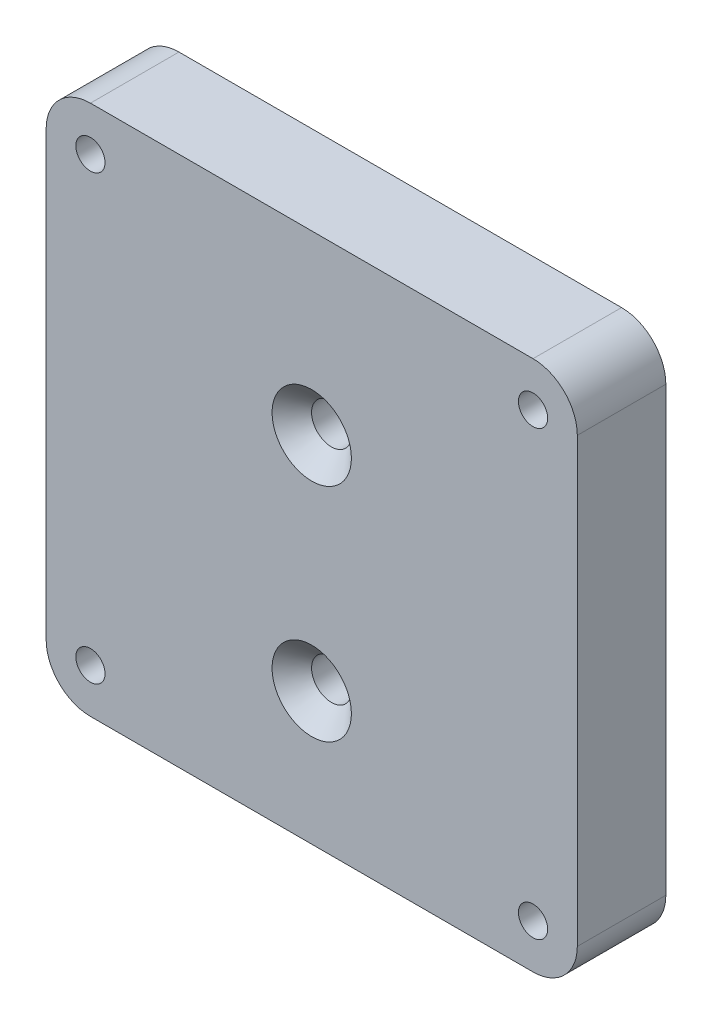
ISO-10303-21;
HEADER;
FILE_DESCRIPTION(('STEP AP214'),'2;1');
FILE_NAME('part.step','',(''),(''),'','','');
FILE_SCHEMA(('AUTOMOTIVE_DESIGN { 1 0 10303 214 1 1 1 1 }'));
ENDSEC;
DATA;
#1=APPLICATION_CONTEXT('core data for automotive mechanical design processes');
#2=APPLICATION_PROTOCOL_DEFINITION('international standard','automotive_design',2000,#1);
#3=PRODUCT_CONTEXT('',#1,'mechanical');
#4=PRODUCT('Part','Part','',(#3));
#5=PRODUCT_RELATED_PRODUCT_CATEGORY('part','',(#4));
#6=PRODUCT_DEFINITION_FORMATION('','',#4);
#7=PRODUCT_DEFINITION_CONTEXT('part definition',#1,'design');
#8=PRODUCT_DEFINITION('design','',#6,#7);
#9=PRODUCT_DEFINITION_SHAPE('','',#8);
#10=(LENGTH_UNIT() NAMED_UNIT(*) SI_UNIT(.MILLI.,.METRE.));
#11=(NAMED_UNIT(*) PLANE_ANGLE_UNIT() SI_UNIT($,.RADIAN.));
#12=(NAMED_UNIT(*) SI_UNIT($,.STERADIAN.) SOLID_ANGLE_UNIT());
#13=UNCERTAINTY_MEASURE_WITH_UNIT(LENGTH_MEASURE(1.E-05),#10,'distance_accuracy_value','');
#14=(GEOMETRIC_REPRESENTATION_CONTEXT(3) GLOBAL_UNCERTAINTY_ASSIGNED_CONTEXT((#13)) GLOBAL_UNIT_ASSIGNED_CONTEXT((#10,
#11,#12)) REPRESENTATION_CONTEXT('',''));
#15=CARTESIAN_POINT('',(0.,0.,0.));
#16=DIRECTION('',(0.,0.,1.));
#17=DIRECTION('',(1.,0.,0.));
#18=AXIS2_PLACEMENT_3D('',#15,#16,#17);
#19=CARTESIAN_POINT('',(0.,60.,10.));
#20=DIRECTION('',(1.,0.,0.));
#21=DIRECTION('',(0.,1.,0.));
#22=AXIS2_PLACEMENT_3D('',#19,#20,#21);
#23=PLANE('',#22);
#24=DIRECTION('',(0.,-1.,0.));
#25=VECTOR('',#24,1.);
#26=CARTESIAN_POINT('',(0.,60.,10.));
#27=LINE('',#26,#25);
#28=CARTESIAN_POINT('',(0.,55.,10.));
#29=VERTEX_POINT('',#28);
#30=CARTESIAN_POINT('',(0.,5.,10.));
#31=VERTEX_POINT('',#30);
#32=EDGE_CURVE('E195',#29,#31,#27,.T.);
#33=ORIENTED_EDGE('',*,*,#32,.F.);
#34=DIRECTION('',(0.,0.,-1.));
#35=VECTOR('',#34,1.);
#36=CARTESIAN_POINT('',(0.,55.,10.));
#37=LINE('',#36,#35);
#38=CARTESIAN_POINT('',(0.,55.,0.));
#39=VERTEX_POINT('',#38);
#40=EDGE_CURVE('E217',#29,#39,#37,.T.);
#41=ORIENTED_EDGE('',*,*,#40,.T.);
#42=DIRECTION('',(0.,-1.,0.));
#43=VECTOR('',#42,1.);
#44=CARTESIAN_POINT('',(0.,60.,0.));
#45=LINE('',#44,#43);
#46=CARTESIAN_POINT('',(0.,5.,0.));
#47=VERTEX_POINT('',#46);
#48=EDGE_CURVE('E194',#39,#47,#45,.T.);
#49=ORIENTED_EDGE('',*,*,#48,.T.);
#50=DIRECTION('',(0.,0.,-1.));
#51=VECTOR('',#50,1.);
#52=CARTESIAN_POINT('',(0.,5.,10.));
#53=LINE('',#52,#51);
#54=EDGE_CURVE('E206',#47,#31,#53,.F.);
#55=ORIENTED_EDGE('',*,*,#54,.T.);
#56=EDGE_LOOP('',(#33,#41,#49,#55));
#57=FACE_BOUND('',#56,.T.);
#58=ADVANCED_FACE('F40',(#57),#23,.F.);
#59=CARTESIAN_POINT('',(0.,0.,10.));
#60=DIRECTION('',(0.,1.,0.));
#61=DIRECTION('',(0.,0.,1.));
#62=AXIS2_PLACEMENT_3D('',#59,#60,#61);
#63=PLANE('',#62);
#64=CARTESIAN_POINT('',(30.,0.,5.));
#65=DIRECTION('',(0.,-1.,0.));
#66=DIRECTION('',(0.,0.,-1.));
#67=AXIS2_PLACEMENT_3D('',#64,#65,#66);
#68=CIRCLE('',#67,1.64999999999999);
#69=CARTESIAN_POINT('',(30.,0.,3.35000000000001));
#70=VERTEX_POINT('',#69);
#71=EDGE_CURVE('E136',#70,#70,#68,.T.);
#72=ORIENTED_EDGE('',*,*,#71,.F.);
#73=EDGE_LOOP('',(#72));
#74=FACE_BOUND('',#73,.T.);
#75=CARTESIAN_POINT('',(14.,0.,5.));
#76=DIRECTION('',(0.,-1.,0.));
#77=DIRECTION('',(0.,0.,-1.));
#78=AXIS2_PLACEMENT_3D('',#75,#76,#77);
#79=CIRCLE('',#78,1.64999999999999);
#80=CARTESIAN_POINT('',(14.,0.,3.35000000000001));
#81=VERTEX_POINT('',#80);
#82=EDGE_CURVE('E135',#81,#81,#79,.T.);
#83=ORIENTED_EDGE('',*,*,#82,.F.);
#84=EDGE_LOOP('',(#83));
#85=FACE_BOUND('',#84,.T.);
#86=CARTESIAN_POINT('',(46.,0.,5.));
#87=DIRECTION('',(0.,-1.,0.));
#88=DIRECTION('',(0.,0.,-1.));
#89=AXIS2_PLACEMENT_3D('',#86,#87,#88);
#90=CIRCLE('',#89,1.64999999999999);
#91=CARTESIAN_POINT('',(46.,0.,3.35000000000001));
#92=VERTEX_POINT('',#91);
#93=EDGE_CURVE('E146',#92,#92,#90,.T.);
#94=ORIENTED_EDGE('',*,*,#93,.F.);
#95=EDGE_LOOP('',(#94));
#96=FACE_BOUND('',#95,.T.);
#97=DIRECTION('',(1.,0.,0.));
#98=VECTOR('',#97,1.);
#99=CARTESIAN_POINT('',(0.,0.,0.));
#100=LINE('',#99,#98);
#101=CARTESIAN_POINT('',(5.,0.,0.));
#102=VERTEX_POINT('',#101);
#103=CARTESIAN_POINT('',(55.,0.,0.));
#104=VERTEX_POINT('',#103);
#105=EDGE_CURVE('E209',#102,#104,#100,.T.);
#106=ORIENTED_EDGE('',*,*,#105,.T.);
#107=DIRECTION('',(0.,0.,-1.));
#108=VECTOR('',#107,1.);
#109=CARTESIAN_POINT('',(55.,0.,10.));
#110=LINE('',#109,#108);
#111=CARTESIAN_POINT('',(55.,0.,10.));
#112=VERTEX_POINT('',#111);
#113=EDGE_CURVE('E11',#104,#112,#110,.F.);
#114=ORIENTED_EDGE('',*,*,#113,.T.);
#115=DIRECTION('',(1.,0.,0.));
#116=VECTOR('',#115,1.);
#117=CARTESIAN_POINT('',(0.,0.,10.));
#118=LINE('',#117,#116);
#119=CARTESIAN_POINT('',(5.,0.,10.));
#120=VERTEX_POINT('',#119);
#121=EDGE_CURVE('E198',#120,#112,#118,.T.);
#122=ORIENTED_EDGE('',*,*,#121,.F.);
#123=DIRECTION('',(0.,0.,-1.));
#124=VECTOR('',#123,1.);
#125=CARTESIAN_POINT('',(5.,0.,10.));
#126=LINE('',#125,#124);
#127=EDGE_CURVE('E48',#120,#102,#126,.T.);
#128=ORIENTED_EDGE('',*,*,#127,.T.);
#129=EDGE_LOOP('',(#106,#114,#122,#128));
#130=FACE_BOUND('',#129,.T.);
#131=ADVANCED_FACE('F248',(#74,#85,#96,#130),#63,.F.);
#132=CARTESIAN_POINT('',(60.,0.,10.));
#133=DIRECTION('',(-1.,0.,0.));
#134=DIRECTION('',(0.,0.,1.));
#135=AXIS2_PLACEMENT_3D('',#132,#133,#134);
#136=PLANE('',#135);
#137=DIRECTION('',(0.,1.,0.));
#138=VECTOR('',#137,1.);
#139=CARTESIAN_POINT('',(60.,0.,0.));
#140=LINE('',#139,#138);
#141=CARTESIAN_POINT('',(60.,5.,0.));
#142=VERTEX_POINT('',#141);
#143=CARTESIAN_POINT('',(60.,55.,0.));
#144=VERTEX_POINT('',#143);
#145=EDGE_CURVE('E212',#142,#144,#140,.T.);
#146=ORIENTED_EDGE('',*,*,#145,.T.);
#147=DIRECTION('',(0.,0.,-1.));
#148=VECTOR('',#147,1.);
#149=CARTESIAN_POINT('',(60.,55.,10.));
#150=LINE('',#149,#148);
#151=CARTESIAN_POINT('',(60.,55.,10.));
#152=VERTEX_POINT('',#151);
#153=EDGE_CURVE('E55',#144,#152,#150,.F.);
#154=ORIENTED_EDGE('',*,*,#153,.T.);
#155=DIRECTION('',(0.,1.,0.));
#156=VECTOR('',#155,1.);
#157=CARTESIAN_POINT('',(60.,0.,10.));
#158=LINE('',#157,#156);
#159=CARTESIAN_POINT('',(60.,5.,10.));
#160=VERTEX_POINT('',#159);
#161=EDGE_CURVE('E201',#160,#152,#158,.T.);
#162=ORIENTED_EDGE('',*,*,#161,.F.);
#163=DIRECTION('',(0.,0.,-1.));
#164=VECTOR('',#163,1.);
#165=CARTESIAN_POINT('',(60.,5.,10.));
#166=LINE('',#165,#164);
#167=EDGE_CURVE('E240',#160,#142,#166,.T.);
#168=ORIENTED_EDGE('',*,*,#167,.T.);
#169=EDGE_LOOP('',(#146,#154,#162,#168));
#170=FACE_BOUND('',#169,.T.);
#171=ADVANCED_FACE('F259',(#170),#136,.F.);
#172=CARTESIAN_POINT('',(60.,60.,10.));
#173=DIRECTION('',(0.,-1.,0.));
#174=DIRECTION('',(1.,0.,0.));
#175=AXIS2_PLACEMENT_3D('',#172,#173,#174);
#176=PLANE('',#175);
#177=DIRECTION('',(-1.,0.,0.));
#178=VECTOR('',#177,1.);
#179=CARTESIAN_POINT('',(60.,60.,0.));
#180=LINE('',#179,#178);
#181=CARTESIAN_POINT('',(55.,60.,0.));
#182=VERTEX_POINT('',#181);
#183=CARTESIAN_POINT('',(4.99999999999999,60.,0.));
#184=VERTEX_POINT('',#183);
#185=EDGE_CURVE('E199',#182,#184,#180,.T.);
#186=ORIENTED_EDGE('',*,*,#185,.T.);
#187=DIRECTION('',(0.,0.,-1.));
#188=VECTOR('',#187,1.);
#189=CARTESIAN_POINT('',(4.99999999999999,60.,10.));
#190=LINE('',#189,#188);
#191=CARTESIAN_POINT('',(4.99999999999999,60.,10.));
#192=VERTEX_POINT('',#191);
#193=EDGE_CURVE('E231',#184,#192,#190,.F.);
#194=ORIENTED_EDGE('',*,*,#193,.T.);
#195=DIRECTION('',(-1.,0.,0.));
#196=VECTOR('',#195,1.);
#197=CARTESIAN_POINT('',(60.,60.,10.));
#198=LINE('',#197,#196);
#199=CARTESIAN_POINT('',(55.,60.,10.));
#200=VERTEX_POINT('',#199);
#201=EDGE_CURVE('E203',#200,#192,#198,.T.);
#202=ORIENTED_EDGE('',*,*,#201,.F.);
#203=DIRECTION('',(0.,0.,-1.));
#204=VECTOR('',#203,1.);
#205=CARTESIAN_POINT('',(55.,60.,10.));
#206=LINE('',#205,#204);
#207=EDGE_CURVE('E228',#200,#182,#206,.T.);
#208=ORIENTED_EDGE('',*,*,#207,.T.);
#209=EDGE_LOOP('',(#186,#194,#202,#208));
#210=FACE_BOUND('',#209,.T.);
#211=ADVANCED_FACE('F268',(#210),#176,.F.);
#212=CARTESIAN_POINT('',(0.,0.,10.));
#213=DIRECTION('',(0.,0.,1.));
#214=DIRECTION('',(1.,0.,0.));
#215=AXIS2_PLACEMENT_3D('',#212,#213,#214);
#216=PLANE('',#215);
#217=CARTESIAN_POINT('',(30.,40.,10.));
#218=DIRECTION('',(0.,0.,1.));
#219=DIRECTION('',(1.,0.,0.));
#220=AXIS2_PLACEMENT_3D('',#217,#218,#219);
#221=CIRCLE('',#220,4.48);
#222=CARTESIAN_POINT('',(34.48,40.,10.));
#223=VERTEX_POINT('',#222);
#224=EDGE_CURVE('E152',#223,#223,#221,.T.);
#225=ORIENTED_EDGE('',*,*,#224,.F.);
#226=EDGE_LOOP('',(#225));
#227=FACE_BOUND('',#226,.T.);
#228=CARTESIAN_POINT('',(30.,15.,10.));
#229=DIRECTION('',(0.,0.,1.));
#230=DIRECTION('',(1.,0.,0.));
#231=AXIS2_PLACEMENT_3D('',#228,#229,#230);
#232=CIRCLE('',#231,4.48);
#233=CARTESIAN_POINT('',(34.48,15.,10.));
#234=VERTEX_POINT('',#233);
#235=EDGE_CURVE('E161',#234,#234,#232,.T.);
#236=ORIENTED_EDGE('',*,*,#235,.F.);
#237=EDGE_LOOP('',(#236));
#238=FACE_BOUND('',#237,.T.);
#239=CARTESIAN_POINT('',(4.99999999999999,55.,10.));
#240=DIRECTION('',(0.,0.,1.));
#241=DIRECTION('',(1.,0.,0.));
#242=AXIS2_PLACEMENT_3D('',#239,#240,#241);
#243=CIRCLE('',#242,1.65);
#244=CARTESIAN_POINT('',(6.64999999999999,55.,10.));
#245=VERTEX_POINT('',#244);
#246=EDGE_CURVE('E170',#245,#245,#243,.T.);
#247=ORIENTED_EDGE('',*,*,#246,.F.);
#248=EDGE_LOOP('',(#247));
#249=FACE_BOUND('',#248,.T.);
#250=CARTESIAN_POINT('',(55.,55.,10.));
#251=DIRECTION('',(0.,0.,1.));
#252=DIRECTION('',(1.,0.,0.));
#253=AXIS2_PLACEMENT_3D('',#250,#251,#252);
#254=CIRCLE('',#253,1.65);
#255=CARTESIAN_POINT('',(56.65,55.,10.));
#256=VERTEX_POINT('',#255);
#257=EDGE_CURVE('E176',#256,#256,#254,.T.);
#258=ORIENTED_EDGE('',*,*,#257,.F.);
#259=EDGE_LOOP('',(#258));
#260=FACE_BOUND('',#259,.T.);
#261=CARTESIAN_POINT('',(55.,5.,10.));
#262=DIRECTION('',(0.,0.,1.));
#263=DIRECTION('',(1.,0.,0.));
#264=AXIS2_PLACEMENT_3D('',#261,#262,#263);
#265=CIRCLE('',#264,1.65);
#266=CARTESIAN_POINT('',(56.65,5.,10.));
#267=VERTEX_POINT('',#266);
#268=EDGE_CURVE('E182',#267,#267,#265,.T.);
#269=ORIENTED_EDGE('',*,*,#268,.F.);
#270=EDGE_LOOP('',(#269));
#271=FACE_BOUND('',#270,.T.);
#272=CARTESIAN_POINT('',(4.99999999999999,4.99999999999999,10.));
#273=DIRECTION('',(0.,0.,1.));
#274=DIRECTION('',(1.,0.,0.));
#275=AXIS2_PLACEMENT_3D('',#272,#273,#274);
#276=CIRCLE('',#275,1.65);
#277=CARTESIAN_POINT('',(6.64999999999999,4.99999999999999,10.));
#278=VERTEX_POINT('',#277);
#279=EDGE_CURVE('E188',#278,#278,#276,.T.);
#280=ORIENTED_EDGE('',*,*,#279,.F.);
#281=EDGE_LOOP('',(#280));
#282=FACE_BOUND('',#281,.T.);
#283=ORIENTED_EDGE('',*,*,#201,.T.);
#284=CARTESIAN_POINT('',(4.99999999999999,55.,10.));
#285=DIRECTION('',(0.,0.,1.));
#286=DIRECTION('',(1.,0.,0.));
#287=AXIS2_PLACEMENT_3D('',#284,#285,#286);
#288=CIRCLE('',#287,5.);
#289=EDGE_CURVE('E238',#192,#29,#288,.T.);
#290=ORIENTED_EDGE('',*,*,#289,.T.);
#291=ORIENTED_EDGE('',*,*,#32,.T.);
#292=CARTESIAN_POINT('',(5.,5.,10.));
#293=DIRECTION('',(0.,0.,1.));
#294=DIRECTION('',(1.,0.,0.));
#295=AXIS2_PLACEMENT_3D('',#292,#293,#294);
#296=CIRCLE('',#295,5.);
#297=EDGE_CURVE('E233',#31,#120,#296,.T.);
#298=ORIENTED_EDGE('',*,*,#297,.T.);
#299=ORIENTED_EDGE('',*,*,#121,.T.);
#300=CARTESIAN_POINT('',(55.,5.,10.));
#301=DIRECTION('',(0.,0.,1.));
#302=DIRECTION('',(1.,0.,0.));
#303=AXIS2_PLACEMENT_3D('',#300,#301,#302);
#304=CIRCLE('',#303,5.);
#305=EDGE_CURVE('E62',#112,#160,#304,.T.);
#306=ORIENTED_EDGE('',*,*,#305,.T.);
#307=ORIENTED_EDGE('',*,*,#161,.T.);
#308=CARTESIAN_POINT('',(55.,55.,10.));
#309=DIRECTION('',(0.,0.,1.));
#310=DIRECTION('',(1.,0.,0.));
#311=AXIS2_PLACEMENT_3D('',#308,#309,#310);
#312=CIRCLE('',#311,5.);
#313=EDGE_CURVE('E236',#152,#200,#312,.T.);
#314=ORIENTED_EDGE('',*,*,#313,.T.);
#315=EDGE_LOOP('',(#283,#290,#291,#298,#299,#306,#307,#314));
#316=FACE_BOUND('',#315,.T.);
#317=ADVANCED_FACE('F261',(#227,#238,#249,#260,#271,#282,#316),#216,.T.);
#318=CARTESIAN_POINT('',(0.,0.,0.));
#319=DIRECTION('',(0.,0.,1.));
#320=DIRECTION('',(1.,0.,0.));
#321=AXIS2_PLACEMENT_3D('',#318,#319,#320);
#322=PLANE('',#321);
#323=CARTESIAN_POINT('',(30.,40.,0.));
#324=DIRECTION('',(0.,0.,1.));
#325=DIRECTION('',(1.,0.,0.));
#326=AXIS2_PLACEMENT_3D('',#323,#324,#325);
#327=CIRCLE('',#326,2.25);
#328=CARTESIAN_POINT('',(32.25,40.,0.));
#329=VERTEX_POINT('',#328);
#330=EDGE_CURVE('E158',#329,#329,#327,.T.);
#331=ORIENTED_EDGE('',*,*,#330,.T.);
#332=EDGE_LOOP('',(#331));
#333=FACE_BOUND('',#332,.T.);
#334=CARTESIAN_POINT('',(30.,15.,0.));
#335=DIRECTION('',(0.,0.,1.));
#336=DIRECTION('',(1.,0.,0.));
#337=AXIS2_PLACEMENT_3D('',#334,#335,#336);
#338=CIRCLE('',#337,2.25);
#339=CARTESIAN_POINT('',(32.25,15.,0.));
#340=VERTEX_POINT('',#339);
#341=EDGE_CURVE('E167',#340,#340,#338,.T.);
#342=ORIENTED_EDGE('',*,*,#341,.T.);
#343=EDGE_LOOP('',(#342));
#344=FACE_BOUND('',#343,.T.);
#345=ORIENTED_EDGE('',*,*,#48,.F.);
#346=CARTESIAN_POINT('',(4.99999999999999,55.,0.));
#347=DIRECTION('',(0.,0.,1.));
#348=DIRECTION('',(1.,0.,0.));
#349=AXIS2_PLACEMENT_3D('',#346,#347,#348);
#350=CIRCLE('',#349,5.);
#351=EDGE_CURVE('E226',#39,#184,#350,.F.);
#352=ORIENTED_EDGE('',*,*,#351,.T.);
#353=ORIENTED_EDGE('',*,*,#185,.F.);
#354=CARTESIAN_POINT('',(55.,55.,0.));
#355=DIRECTION('',(0.,0.,1.));
#356=DIRECTION('',(1.,0.,0.));
#357=AXIS2_PLACEMENT_3D('',#354,#355,#356);
#358=CIRCLE('',#357,5.);
#359=EDGE_CURVE('E224',#182,#144,#358,.F.);
#360=ORIENTED_EDGE('',*,*,#359,.T.);
#361=ORIENTED_EDGE('',*,*,#145,.F.);
#362=CARTESIAN_POINT('',(55.,5.,0.));
#363=DIRECTION('',(0.,0.,1.));
#364=DIRECTION('',(1.,0.,0.));
#365=AXIS2_PLACEMENT_3D('',#362,#363,#364);
#366=CIRCLE('',#365,5.);
#367=EDGE_CURVE('E222',#142,#104,#366,.F.);
#368=ORIENTED_EDGE('',*,*,#367,.T.);
#369=ORIENTED_EDGE('',*,*,#105,.F.);
#370=CARTESIAN_POINT('',(5.,5.,0.));
#371=DIRECTION('',(0.,0.,1.));
#372=DIRECTION('',(1.,0.,0.));
#373=AXIS2_PLACEMENT_3D('',#370,#371,#372);
#374=CIRCLE('',#373,5.);
#375=EDGE_CURVE('E220',#102,#47,#374,.F.);
#376=ORIENTED_EDGE('',*,*,#375,.T.);
#377=EDGE_LOOP('',(#345,#352,#353,#360,#361,#368,#369,#376));
#378=FACE_BOUND('',#377,.T.);
#379=ADVANCED_FACE('F254',(#333,#344,#378),#322,.F.);
#380=CARTESIAN_POINT('',(4.99999999999999,4.99999999999999,2.89142002139548));
#381=DIRECTION('',(0.,0.,1.));
#382=DIRECTION('',(1.,0.,0.));
#383=AXIS2_PLACEMENT_3D('',#380,#381,#382);
#384=CONICAL_SURFACE('',#383,1.65,1.02974425867665);
#385=CARTESIAN_POINT('',(4.99999999999999,4.99999999999999,1.9));
#386=VERTEX_POINT('',#385);
#387=VERTEX_LOOP('',#386);
#388=FACE_BOUND('',#387,.T.);
#389=CARTESIAN_POINT('',(4.99999999999999,4.99999999999999,2.89142002139548));
#390=DIRECTION('',(0.,0.,1.));
#391=DIRECTION('',(1.,0.,0.));
#392=AXIS2_PLACEMENT_3D('',#389,#390,#391);
#393=CIRCLE('',#392,1.65);
#394=CARTESIAN_POINT('',(6.64999999999999,4.99999999999999,2.89142002139548));
#395=VERTEX_POINT('',#394);
#396=EDGE_CURVE('E191',#395,#395,#393,.T.);
#397=ORIENTED_EDGE('',*,*,#396,.T.);
#398=EDGE_LOOP('',(#397));
#399=FACE_BOUND('',#398,.T.);
#400=ADVANCED_FACE('F466',(#388,#399),#384,.F.);
#401=CARTESIAN_POINT('',(4.99999999999999,4.99999999999999,10.));
#402=DIRECTION('',(0.,0.,1.));
#403=DIRECTION('',(1.,0.,0.));
#404=AXIS2_PLACEMENT_3D('',#401,#402,#403);
#405=CYLINDRICAL_SURFACE('',#404,1.65);
#406=ORIENTED_EDGE('',*,*,#396,.F.);
#407=EDGE_LOOP('',(#406));
#408=FACE_BOUND('',#407,.T.);
#409=ORIENTED_EDGE('',*,*,#279,.T.);
#410=EDGE_LOOP('',(#409));
#411=FACE_BOUND('',#410,.T.);
#412=ADVANCED_FACE('F457',(#408,#411),#405,.F.);
#413=CARTESIAN_POINT('',(55.,5.,2.89142002139548));
#414=DIRECTION('',(0.,0.,1.));
#415=DIRECTION('',(1.,0.,0.));
#416=AXIS2_PLACEMENT_3D('',#413,#414,#415);
#417=CONICAL_SURFACE('',#416,1.65,1.02974425867665);
#418=CARTESIAN_POINT('',(55.,5.,1.9));
#419=VERTEX_POINT('',#418);
#420=VERTEX_LOOP('',#419);
#421=FACE_BOUND('',#420,.T.);
#422=CARTESIAN_POINT('',(55.,5.,2.89142002139548));
#423=DIRECTION('',(0.,0.,1.));
#424=DIRECTION('',(1.,0.,0.));
#425=AXIS2_PLACEMENT_3D('',#422,#423,#424);
#426=CIRCLE('',#425,1.65);
#427=CARTESIAN_POINT('',(56.65,5.,2.89142002139548));
#428=VERTEX_POINT('',#427);
#429=EDGE_CURVE('E185',#428,#428,#426,.T.);
#430=ORIENTED_EDGE('',*,*,#429,.T.);
#431=EDGE_LOOP('',(#430));
#432=FACE_BOUND('',#431,.T.);
#433=ADVANCED_FACE('F447',(#421,#432),#417,.F.);
#434=CARTESIAN_POINT('',(55.,5.,10.));
#435=DIRECTION('',(0.,0.,1.));
#436=DIRECTION('',(1.,0.,0.));
#437=AXIS2_PLACEMENT_3D('',#434,#435,#436);
#438=CYLINDRICAL_SURFACE('',#437,1.65);
#439=ORIENTED_EDGE('',*,*,#429,.F.);
#440=EDGE_LOOP('',(#439));
#441=FACE_BOUND('',#440,.T.);
#442=ORIENTED_EDGE('',*,*,#268,.T.);
#443=EDGE_LOOP('',(#442));
#444=FACE_BOUND('',#443,.T.);
#445=ADVANCED_FACE('F438',(#441,#444),#438,.F.);
#446=CARTESIAN_POINT('',(55.,55.,2.89142002139548));
#447=DIRECTION('',(0.,0.,1.));
#448=DIRECTION('',(1.,0.,0.));
#449=AXIS2_PLACEMENT_3D('',#446,#447,#448);
#450=CONICAL_SURFACE('',#449,1.65,1.02974425867665);
#451=CARTESIAN_POINT('',(55.,55.,1.9));
#452=VERTEX_POINT('',#451);
#453=VERTEX_LOOP('',#452);
#454=FACE_BOUND('',#453,.T.);
#455=CARTESIAN_POINT('',(55.,55.,2.89142002139548));
#456=DIRECTION('',(0.,0.,1.));
#457=DIRECTION('',(1.,0.,0.));
#458=AXIS2_PLACEMENT_3D('',#455,#456,#457);
#459=CIRCLE('',#458,1.65);
#460=CARTESIAN_POINT('',(56.65,55.,2.89142002139548));
#461=VERTEX_POINT('',#460);
#462=EDGE_CURVE('E179',#461,#461,#459,.T.);
#463=ORIENTED_EDGE('',*,*,#462,.T.);
#464=EDGE_LOOP('',(#463));
#465=FACE_BOUND('',#464,.T.);
#466=ADVANCED_FACE('F428',(#454,#465),#450,.F.);
#467=CARTESIAN_POINT('',(55.,55.,10.));
#468=DIRECTION('',(0.,0.,1.));
#469=DIRECTION('',(1.,0.,0.));
#470=AXIS2_PLACEMENT_3D('',#467,#468,#469);
#471=CYLINDRICAL_SURFACE('',#470,1.65);
#472=ORIENTED_EDGE('',*,*,#462,.F.);
#473=EDGE_LOOP('',(#472));
#474=FACE_BOUND('',#473,.T.);
#475=ORIENTED_EDGE('',*,*,#257,.T.);
#476=EDGE_LOOP('',(#475));
#477=FACE_BOUND('',#476,.T.);
#478=ADVANCED_FACE('F419',(#474,#477),#471,.F.);
#479=CARTESIAN_POINT('',(4.99999999999999,55.,2.89142002139548));
#480=DIRECTION('',(0.,0.,1.));
#481=DIRECTION('',(1.,0.,0.));
#482=AXIS2_PLACEMENT_3D('',#479,#480,#481);
#483=CONICAL_SURFACE('',#482,1.65,1.02974425867665);
#484=CARTESIAN_POINT('',(4.99999999999999,55.,1.9));
#485=VERTEX_POINT('',#484);
#486=VERTEX_LOOP('',#485);
#487=FACE_BOUND('',#486,.T.);
#488=CARTESIAN_POINT('',(4.99999999999999,55.,2.89142002139548));
#489=DIRECTION('',(0.,0.,1.));
#490=DIRECTION('',(1.,0.,0.));
#491=AXIS2_PLACEMENT_3D('',#488,#489,#490);
#492=CIRCLE('',#491,1.65);
#493=CARTESIAN_POINT('',(6.64999999999999,55.,2.89142002139548));
#494=VERTEX_POINT('',#493);
#495=EDGE_CURVE('E173',#494,#494,#492,.T.);
#496=ORIENTED_EDGE('',*,*,#495,.T.);
#497=EDGE_LOOP('',(#496));
#498=FACE_BOUND('',#497,.T.);
#499=ADVANCED_FACE('F409',(#487,#498),#483,.F.);
#500=CARTESIAN_POINT('',(4.99999999999999,55.,10.));
#501=DIRECTION('',(0.,0.,1.));
#502=DIRECTION('',(1.,0.,0.));
#503=AXIS2_PLACEMENT_3D('',#500,#501,#502);
#504=CYLINDRICAL_SURFACE('',#503,1.65);
#505=ORIENTED_EDGE('',*,*,#495,.F.);
#506=EDGE_LOOP('',(#505));
#507=FACE_BOUND('',#506,.T.);
#508=ORIENTED_EDGE('',*,*,#246,.T.);
#509=EDGE_LOOP('',(#508));
#510=FACE_BOUND('',#509,.T.);
#511=ADVANCED_FACE('F400',(#507,#510),#504,.F.);
#512=CARTESIAN_POINT('',(30.,15.,10.));
#513=DIRECTION('',(0.,0.,1.));
#514=DIRECTION('',(1.,0.,0.));
#515=AXIS2_PLACEMENT_3D('',#512,#513,#514);
#516=CYLINDRICAL_SURFACE('',#515,2.25);
#517=ORIENTED_EDGE('',*,*,#341,.F.);
#518=EDGE_LOOP('',(#517));
#519=FACE_BOUND('',#518,.T.);
#520=CARTESIAN_POINT('',(30.,15.,7.77));
#521=DIRECTION('',(0.,0.,1.));
#522=DIRECTION('',(1.,0.,0.));
#523=AXIS2_PLACEMENT_3D('',#520,#521,#522);
#524=CIRCLE('',#523,2.25);
#525=CARTESIAN_POINT('',(32.25,15.,7.77));
#526=VERTEX_POINT('',#525);
#527=EDGE_CURVE('E164',#526,#526,#524,.T.);
#528=ORIENTED_EDGE('',*,*,#527,.T.);
#529=EDGE_LOOP('',(#528));
#530=FACE_BOUND('',#529,.T.);
#531=ADVANCED_FACE('F391',(#519,#530),#516,.F.);
#532=CARTESIAN_POINT('',(30.,15.,10.));
#533=DIRECTION('',(0.,0.,1.));
#534=DIRECTION('',(1.,0.,0.));
#535=AXIS2_PLACEMENT_3D('',#532,#533,#534);
#536=CONICAL_SURFACE('',#535,4.48,0.785398163397447);
#537=ORIENTED_EDGE('',*,*,#527,.F.);
#538=EDGE_LOOP('',(#537));
#539=FACE_BOUND('',#538,.T.);
#540=ORIENTED_EDGE('',*,*,#235,.T.);
#541=EDGE_LOOP('',(#540));
#542=FACE_BOUND('',#541,.T.);
#543=ADVANCED_FACE('F382',(#539,#542),#536,.F.);
#544=CARTESIAN_POINT('',(30.,40.,10.));
#545=DIRECTION('',(0.,0.,1.));
#546=DIRECTION('',(1.,0.,0.));
#547=AXIS2_PLACEMENT_3D('',#544,#545,#546);
#548=CYLINDRICAL_SURFACE('',#547,2.25);
#549=ORIENTED_EDGE('',*,*,#330,.F.);
#550=EDGE_LOOP('',(#549));
#551=FACE_BOUND('',#550,.T.);
#552=CARTESIAN_POINT('',(30.,40.,7.77));
#553=DIRECTION('',(0.,0.,1.));
#554=DIRECTION('',(1.,0.,0.));
#555=AXIS2_PLACEMENT_3D('',#552,#553,#554);
#556=CIRCLE('',#555,2.25);
#557=CARTESIAN_POINT('',(32.25,40.,7.77));
#558=VERTEX_POINT('',#557);
#559=EDGE_CURVE('E155',#558,#558,#556,.T.);
#560=ORIENTED_EDGE('',*,*,#559,.T.);
#561=EDGE_LOOP('',(#560));
#562=FACE_BOUND('',#561,.T.);
#563=ADVANCED_FACE('F373',(#551,#562),#548,.F.);
#564=CARTESIAN_POINT('',(30.,40.,10.));
#565=DIRECTION('',(0.,0.,1.));
#566=DIRECTION('',(1.,0.,0.));
#567=AXIS2_PLACEMENT_3D('',#564,#565,#566);
#568=CONICAL_SURFACE('',#567,4.48,0.785398163397447);
#569=ORIENTED_EDGE('',*,*,#559,.F.);
#570=EDGE_LOOP('',(#569));
#571=FACE_BOUND('',#570,.T.);
#572=ORIENTED_EDGE('',*,*,#224,.T.);
#573=EDGE_LOOP('',(#572));
#574=FACE_BOUND('',#573,.T.);
#575=ADVANCED_FACE('F364',(#571,#574),#568,.F.);
#576=CARTESIAN_POINT('',(46.,8.,5.));
#577=DIRECTION('',(0.,-1.,0.));
#578=DIRECTION('',(0.,0.,-1.));
#579=AXIS2_PLACEMENT_3D('',#576,#577,#578);
#580=CONICAL_SURFACE('',#579,1.64999999999999,1.02974425867665);
#581=CARTESIAN_POINT('',(46.,8.99142002139547,5.));
#582=VERTEX_POINT('',#581);
#583=VERTEX_LOOP('',#582);
#584=FACE_BOUND('',#583,.T.);
#585=CARTESIAN_POINT('',(46.,8.,5.));
#586=DIRECTION('',(0.,-1.,0.));
#587=DIRECTION('',(0.,0.,-1.));
#588=AXIS2_PLACEMENT_3D('',#585,#586,#587);
#589=CIRCLE('',#588,1.64999999999999);
#590=CARTESIAN_POINT('',(46.,8.,3.35000000000001));
#591=VERTEX_POINT('',#590);
#592=EDGE_CURVE('E149',#591,#591,#589,.T.);
#593=ORIENTED_EDGE('',*,*,#592,.T.);
#594=EDGE_LOOP('',(#593));
#595=FACE_BOUND('',#594,.T.);
#596=ADVANCED_FACE('F354',(#584,#595),#580,.F.);
#597=CARTESIAN_POINT('',(46.,0.,5.));
#598=DIRECTION('',(0.,-1.,0.));
#599=DIRECTION('',(0.,0.,-1.));
#600=AXIS2_PLACEMENT_3D('',#597,#598,#599);
#601=CYLINDRICAL_SURFACE('',#600,1.64999999999999);
#602=ORIENTED_EDGE('',*,*,#592,.F.);
#603=EDGE_LOOP('',(#602));
#604=FACE_BOUND('',#603,.T.);
#605=ORIENTED_EDGE('',*,*,#93,.T.);
#606=EDGE_LOOP('',(#605));
#607=FACE_BOUND('',#606,.T.);
#608=ADVANCED_FACE('F345',(#604,#607),#601,.F.);
#609=CARTESIAN_POINT('',(14.,8.,5.));
#610=DIRECTION('',(0.,-1.,0.));
#611=DIRECTION('',(0.,0.,-1.));
#612=AXIS2_PLACEMENT_3D('',#609,#610,#611);
#613=CONICAL_SURFACE('',#612,1.64999999999999,1.02974425867665);
#614=CARTESIAN_POINT('',(14.,8.99142002139547,5.));
#615=VERTEX_POINT('',#614);
#616=VERTEX_LOOP('',#615);
#617=FACE_BOUND('',#616,.T.);
#618=CARTESIAN_POINT('',(14.,8.,5.));
#619=DIRECTION('',(0.,-1.,0.));
#620=DIRECTION('',(0.,0.,-1.));
#621=AXIS2_PLACEMENT_3D('',#618,#619,#620);
#622=CIRCLE('',#621,1.64999999999999);
#623=CARTESIAN_POINT('',(14.,8.,3.35000000000001));
#624=VERTEX_POINT('',#623);
#625=EDGE_CURVE('E139',#624,#624,#622,.T.);
#626=ORIENTED_EDGE('',*,*,#625,.T.);
#627=EDGE_LOOP('',(#626));
#628=FACE_BOUND('',#627,.T.);
#629=ADVANCED_FACE('F335',(#617,#628),#613,.F.);
#630=CARTESIAN_POINT('',(14.,0.,5.));
#631=DIRECTION('',(0.,-1.,0.));
#632=DIRECTION('',(0.,0.,-1.));
#633=AXIS2_PLACEMENT_3D('',#630,#631,#632);
#634=CYLINDRICAL_SURFACE('',#633,1.64999999999999);
#635=ORIENTED_EDGE('',*,*,#625,.F.);
#636=EDGE_LOOP('',(#635));
#637=FACE_BOUND('',#636,.T.);
#638=ORIENTED_EDGE('',*,*,#82,.T.);
#639=EDGE_LOOP('',(#638));
#640=FACE_BOUND('',#639,.T.);
#641=ADVANCED_FACE('F129',(#637,#640),#634,.F.);
#642=CARTESIAN_POINT('',(30.,8.,5.));
#643=DIRECTION('',(0.,-1.,0.));
#644=DIRECTION('',(0.,0.,-1.));
#645=AXIS2_PLACEMENT_3D('',#642,#643,#644);
#646=CONICAL_SURFACE('',#645,1.64999999999999,1.02974425867665);
#647=CARTESIAN_POINT('',(30.,8.99142002139547,5.));
#648=VERTEX_POINT('',#647);
#649=VERTEX_LOOP('',#648);
#650=FACE_BOUND('',#649,.T.);
#651=CARTESIAN_POINT('',(30.,8.,5.));
#652=DIRECTION('',(0.,-1.,0.));
#653=DIRECTION('',(0.,0.,-1.));
#654=AXIS2_PLACEMENT_3D('',#651,#652,#653);
#655=CIRCLE('',#654,1.64999999999999);
#656=CARTESIAN_POINT('',(30.,8.,3.35000000000001));
#657=VERTEX_POINT('',#656);
#658=EDGE_CURVE('E133',#657,#657,#655,.T.);
#659=ORIENTED_EDGE('',*,*,#658,.T.);
#660=EDGE_LOOP('',(#659));
#661=FACE_BOUND('',#660,.T.);
#662=ADVANCED_FACE('F125',(#650,#661),#646,.F.);
#663=CARTESIAN_POINT('',(30.,0.,5.));
#664=DIRECTION('',(0.,-1.,0.));
#665=DIRECTION('',(0.,0.,-1.));
#666=AXIS2_PLACEMENT_3D('',#663,#664,#665);
#667=CYLINDRICAL_SURFACE('',#666,1.64999999999999);
#668=ORIENTED_EDGE('',*,*,#658,.F.);
#669=EDGE_LOOP('',(#668));
#670=FACE_BOUND('',#669,.T.);
#671=ORIENTED_EDGE('',*,*,#71,.T.);
#672=EDGE_LOOP('',(#671));
#673=FACE_BOUND('',#672,.T.);
#674=ADVANCED_FACE('F128',(#670,#673),#667,.F.);
#675=CARTESIAN_POINT('',(4.99999999999999,55.,10.));
#676=DIRECTION('',(0.,0.,-1.));
#677=DIRECTION('',(-1.,0.,0.));
#678=AXIS2_PLACEMENT_3D('',#675,#676,#677);
#679=CYLINDRICAL_SURFACE('',#678,5.);
#680=ORIENTED_EDGE('',*,*,#289,.F.);
#681=ORIENTED_EDGE('',*,*,#193,.F.);
#682=ORIENTED_EDGE('',*,*,#351,.F.);
#683=ORIENTED_EDGE('',*,*,#40,.F.);
#684=EDGE_LOOP('',(#680,#681,#682,#683));
#685=FACE_BOUND('',#684,.T.);
#686=ADVANCED_FACE('F273',(#685),#679,.T.);
#687=CARTESIAN_POINT('',(55.,55.,10.));
#688=DIRECTION('',(0.,0.,-1.));
#689=DIRECTION('',(-1.,0.,0.));
#690=AXIS2_PLACEMENT_3D('',#687,#688,#689);
#691=CYLINDRICAL_SURFACE('',#690,5.);
#692=ORIENTED_EDGE('',*,*,#313,.F.);
#693=ORIENTED_EDGE('',*,*,#153,.F.);
#694=ORIENTED_EDGE('',*,*,#359,.F.);
#695=ORIENTED_EDGE('',*,*,#207,.F.);
#696=EDGE_LOOP('',(#692,#693,#694,#695));
#697=FACE_BOUND('',#696,.T.);
#698=ADVANCED_FACE('F265',(#697),#691,.T.);
#699=CARTESIAN_POINT('',(55.,5.,10.));
#700=DIRECTION('',(0.,0.,-1.));
#701=DIRECTION('',(-1.,0.,0.));
#702=AXIS2_PLACEMENT_3D('',#699,#700,#701);
#703=CYLINDRICAL_SURFACE('',#702,5.);
#704=ORIENTED_EDGE('',*,*,#305,.F.);
#705=ORIENTED_EDGE('',*,*,#113,.F.);
#706=ORIENTED_EDGE('',*,*,#367,.F.);
#707=ORIENTED_EDGE('',*,*,#167,.F.);
#708=EDGE_LOOP('',(#704,#705,#706,#707));
#709=FACE_BOUND('',#708,.T.);
#710=ADVANCED_FACE('F258',(#709),#703,.T.);
#711=CARTESIAN_POINT('',(5.,5.,10.));
#712=DIRECTION('',(0.,0.,-1.));
#713=DIRECTION('',(-1.,0.,0.));
#714=AXIS2_PLACEMENT_3D('',#711,#712,#713);
#715=CYLINDRICAL_SURFACE('',#714,5.);
#716=ORIENTED_EDGE('',*,*,#297,.F.);
#717=ORIENTED_EDGE('',*,*,#54,.F.);
#718=ORIENTED_EDGE('',*,*,#375,.F.);
#719=ORIENTED_EDGE('',*,*,#127,.F.);
#720=EDGE_LOOP('',(#716,#717,#718,#719));
#721=FACE_BOUND('',#720,.T.);
#722=ADVANCED_FACE('F42',(#721),#715,.T.);
#723=CLOSED_SHELL('',(#58,#131,#171,#211,#317,#379,#400,#412,#433,#445,#466,#478,#499,#511,#531,
#543,#563,#575,#596,#608,#629,#641,#662,#674,#686,#698,#710,#722));
#724=MANIFOLD_SOLID_BREP('B2',#723);
#725=ADVANCED_BREP_SHAPE_REPRESENTATION('',(#18,#724),#14);
#726=SHAPE_DEFINITION_REPRESENTATION(#9,#725);
ENDSEC;
END-ISO-10303-21;
